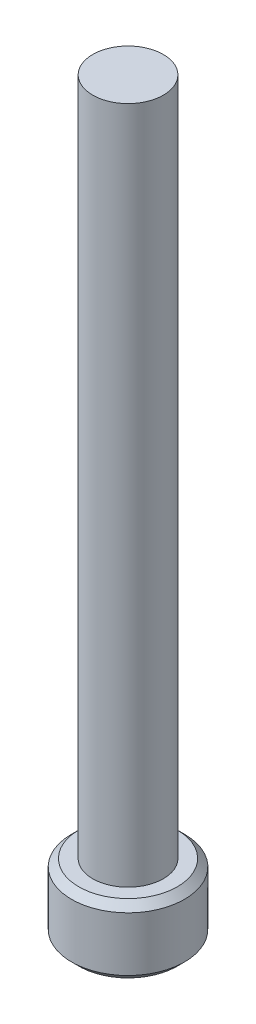
ISO-10303-21;
HEADER;
FILE_DESCRIPTION(('STEP AP214'),'2;1');
FILE_NAME('part.step','',(''),(''),'','','');
FILE_SCHEMA(('AUTOMOTIVE_DESIGN { 1 0 10303 214 1 1 1 1 }'));
ENDSEC;
DATA;
#1=APPLICATION_CONTEXT('core data for automotive mechanical design processes');
#2=APPLICATION_PROTOCOL_DEFINITION('international standard','automotive_design',2000,#1);
#3=PRODUCT_CONTEXT('',#1,'mechanical');
#4=PRODUCT('Part','Part','',(#3));
#5=PRODUCT_RELATED_PRODUCT_CATEGORY('part','',(#4));
#6=PRODUCT_DEFINITION_FORMATION('','',#4);
#7=PRODUCT_DEFINITION_CONTEXT('part definition',#1,'design');
#8=PRODUCT_DEFINITION('design','',#6,#7);
#9=PRODUCT_DEFINITION_SHAPE('','',#8);
#10=(LENGTH_UNIT() NAMED_UNIT(*) SI_UNIT(.MILLI.,.METRE.));
#11=(NAMED_UNIT(*) PLANE_ANGLE_UNIT() SI_UNIT($,.RADIAN.));
#12=(NAMED_UNIT(*) SI_UNIT($,.STERADIAN.) SOLID_ANGLE_UNIT());
#13=UNCERTAINTY_MEASURE_WITH_UNIT(LENGTH_MEASURE(1.E-05),#10,'distance_accuracy_value','');
#14=(GEOMETRIC_REPRESENTATION_CONTEXT(3) GLOBAL_UNCERTAINTY_ASSIGNED_CONTEXT((#13)) GLOBAL_UNIT_ASSIGNED_CONTEXT((#10,
#11,#12)) REPRESENTATION_CONTEXT('',''));
#15=CARTESIAN_POINT('',(0.,0.,0.));
#16=DIRECTION('',(0.,0.,1.));
#17=DIRECTION('',(1.,0.,0.));
#18=AXIS2_PLACEMENT_3D('',#15,#16,#17);
#19=CARTESIAN_POINT('',(0.,47.625,0.));
#20=DIRECTION('',(0.,-1.,0.));
#21=DIRECTION('',(0.,0.,-1.));
#22=AXIS2_PLACEMENT_3D('',#19,#20,#21);
#23=CYLINDRICAL_SURFACE('',#22,2.4765);
#24=CARTESIAN_POINT('',(0.,47.625,0.));
#25=DIRECTION('',(0.,1.,0.));
#26=DIRECTION('',(0.,0.,1.));
#27=AXIS2_PLACEMENT_3D('',#24,#25,#26);
#28=CIRCLE('',#27,2.4765);
#29=CARTESIAN_POINT('',(0.,47.625,2.4765));
#30=VERTEX_POINT('',#29);
#31=EDGE_CURVE('E173',#30,#30,#28,.T.);
#32=ORIENTED_EDGE('',*,*,#31,.F.);
#33=EDGE_LOOP('',(#32));
#34=FACE_BOUND('',#33,.T.);
#35=CARTESIAN_POINT('',(0.,0.,0.));
#36=DIRECTION('',(0.,1.,0.));
#37=DIRECTION('',(0.,0.,1.));
#38=AXIS2_PLACEMENT_3D('',#35,#36,#37);
#39=CIRCLE('',#38,2.4765);
#40=CARTESIAN_POINT('',(0.,0.,2.4765));
#41=VERTEX_POINT('',#40);
#42=EDGE_CURVE('E163',#41,#41,#39,.T.);
#43=ORIENTED_EDGE('',*,*,#42,.T.);
#44=EDGE_LOOP('',(#43));
#45=FACE_BOUND('',#44,.T.);
#46=ADVANCED_FACE('F47',(#34,#45),#23,.T.);
#47=CARTESIAN_POINT('',(0.,47.625,0.));
#48=DIRECTION('',(0.,1.,0.));
#49=DIRECTION('',(0.,0.,1.));
#50=AXIS2_PLACEMENT_3D('',#47,#48,#49);
#51=PLANE('',#50);
#52=ORIENTED_EDGE('',*,*,#31,.T.);
#53=EDGE_LOOP('',(#52));
#54=FACE_BOUND('',#53,.T.);
#55=ADVANCED_FACE('F203',(#54),#51,.T.);
#56=CARTESIAN_POINT('',(0.,-4.826,0.));
#57=DIRECTION('',(0.,1.,0.));
#58=DIRECTION('',(0.,0.,1.));
#59=AXIS2_PLACEMENT_3D('',#56,#57,#58);
#60=CYLINDRICAL_SURFACE('',#59,3.9624);
#61=CARTESIAN_POINT('',(0.,-0.507999999999989,0.));
#62=DIRECTION('',(0.,-1.,0.));
#63=DIRECTION('',(0.,0.,-1.));
#64=AXIS2_PLACEMENT_3D('',#61,#62,#63);
#65=CIRCLE('',#64,3.9624);
#66=CARTESIAN_POINT('',(0.,-0.507999999999989,-3.9624));
#67=VERTEX_POINT('',#66);
#68=EDGE_CURVE('E184',#67,#67,#65,.T.);
#69=ORIENTED_EDGE('',*,*,#68,.T.);
#70=EDGE_LOOP('',(#69));
#71=FACE_BOUND('',#70,.T.);
#72=CARTESIAN_POINT('',(0.,-4.318,0.));
#73=DIRECTION('',(0.,-1.,0.));
#74=DIRECTION('',(0.,0.,-1.));
#75=AXIS2_PLACEMENT_3D('',#72,#73,#74);
#76=CIRCLE('',#75,3.9624);
#77=CARTESIAN_POINT('',(0.,-4.318,-3.9624));
#78=VERTEX_POINT('',#77);
#79=EDGE_CURVE('E177',#78,#78,#76,.F.);
#80=ORIENTED_EDGE('',*,*,#79,.T.);
#81=EDGE_LOOP('',(#80));
#82=FACE_BOUND('',#81,.T.);
#83=ADVANCED_FACE('F199',(#71,#82),#60,.T.);
#84=CARTESIAN_POINT('',(0.,-4.826,0.));
#85=DIRECTION('',(0.,-1.,0.));
#86=DIRECTION('',(0.,0.,-1.));
#87=AXIS2_PLACEMENT_3D('',#84,#85,#86);
#88=PLANE('',#87);
#89=CARTESIAN_POINT('',(0.,-4.826,0.));
#90=DIRECTION('',(0.,-1.,0.));
#91=DIRECTION('',(0.,0.,-1.));
#92=AXIS2_PLACEMENT_3D('',#89,#90,#91);
#93=CIRCLE('',#92,3.4544);
#94=CARTESIAN_POINT('',(0.,-4.826,-3.4544));
#95=VERTEX_POINT('',#94);
#96=EDGE_CURVE('E11',#95,#95,#93,.T.);
#97=ORIENTED_EDGE('',*,*,#96,.T.);
#98=EDGE_LOOP('',(#97));
#99=FACE_BOUND('',#98,.T.);
#100=DIRECTION('',(0.5,0.,0.866025403784439));
#101=VECTOR('',#100,1.);
#102=CARTESIAN_POINT('',(1.14567944042316,-4.826,-1.984375));
#103=LINE('',#102,#101);
#104=CARTESIAN_POINT('',(1.14567944042316,-4.826,-1.984375));
#105=VERTEX_POINT('',#104);
#106=CARTESIAN_POINT('',(2.29135888084633,-4.826,0.));
#107=VERTEX_POINT('',#106);
#108=EDGE_CURVE('E64',#105,#107,#103,.T.);
#109=ORIENTED_EDGE('',*,*,#108,.F.);
#110=DIRECTION('',(1.,0.,0.));
#111=VECTOR('',#110,1.);
#112=CARTESIAN_POINT('',(-1.14567944042316,-4.826,-1.984375));
#113=LINE('',#112,#111);
#114=CARTESIAN_POINT('',(-1.14567944042316,-4.826,-1.984375));
#115=VERTEX_POINT('',#114);
#116=EDGE_CURVE('E157',#115,#105,#113,.T.);
#117=ORIENTED_EDGE('',*,*,#116,.F.);
#118=DIRECTION('',(0.5,0.,-0.866025403784439));
#119=VECTOR('',#118,1.);
#120=CARTESIAN_POINT('',(-2.29135888084633,-4.826,0.));
#121=LINE('',#120,#119);
#122=CARTESIAN_POINT('',(-2.29135888084633,-4.826,0.));
#123=VERTEX_POINT('',#122);
#124=EDGE_CURVE('E154',#123,#115,#121,.T.);
#125=ORIENTED_EDGE('',*,*,#124,.F.);
#126=DIRECTION('',(-0.5,0.,-0.866025403784439));
#127=VECTOR('',#126,1.);
#128=CARTESIAN_POINT('',(-1.14567944042316,-4.826,1.984375));
#129=LINE('',#128,#127);
#130=CARTESIAN_POINT('',(-1.14567944042316,-4.826,1.984375));
#131=VERTEX_POINT('',#130);
#132=EDGE_CURVE('E112',#131,#123,#129,.T.);
#133=ORIENTED_EDGE('',*,*,#132,.F.);
#134=DIRECTION('',(-1.,0.,0.));
#135=VECTOR('',#134,1.);
#136=CARTESIAN_POINT('',(1.14567944042316,-4.826,1.984375));
#137=LINE('',#136,#135);
#138=CARTESIAN_POINT('',(1.14567944042316,-4.826,1.984375));
#139=VERTEX_POINT('',#138);
#140=EDGE_CURVE('E148',#139,#131,#137,.T.);
#141=ORIENTED_EDGE('',*,*,#140,.F.);
#142=DIRECTION('',(-0.5,0.,0.866025403784439));
#143=VECTOR('',#142,1.);
#144=CARTESIAN_POINT('',(2.29135888084633,-4.826,0.));
#145=LINE('',#144,#143);
#146=EDGE_CURVE('E144',#107,#139,#145,.T.);
#147=ORIENTED_EDGE('',*,*,#146,.F.);
#148=EDGE_LOOP('',(#109,#117,#125,#133,#141,#147));
#149=FACE_BOUND('',#148,.T.);
#150=ADVANCED_FACE('F202',(#99,#149),#88,.T.);
#151=CARTESIAN_POINT('',(0.,0.,0.));
#152=DIRECTION('',(0.,-1.,0.));
#153=DIRECTION('',(0.,0.,-1.));
#154=AXIS2_PLACEMENT_3D('',#151,#152,#153);
#155=PLANE('',#154);
#156=CARTESIAN_POINT('',(0.,0.,0.));
#157=DIRECTION('',(0.,-1.,0.));
#158=DIRECTION('',(0.,0.,-1.));
#159=AXIS2_PLACEMENT_3D('',#156,#157,#158);
#160=CIRCLE('',#159,3.45440000000001);
#161=CARTESIAN_POINT('',(0.,0.,-3.45440000000001));
#162=VERTEX_POINT('',#161);
#163=EDGE_CURVE('E57',#162,#162,#160,.F.);
#164=ORIENTED_EDGE('',*,*,#163,.T.);
#165=EDGE_LOOP('',(#164));
#166=FACE_BOUND('',#165,.T.);
#167=ORIENTED_EDGE('',*,*,#42,.F.);
#168=EDGE_LOOP('',(#167));
#169=FACE_BOUND('',#168,.T.);
#170=ADVANCED_FACE('F191',(#166,#169),#155,.F.);
#171=CARTESIAN_POINT('',(1.14567944042316,-2.54,-1.984375));
#172=DIRECTION('',(0.866025403784439,0.,-0.5));
#173=DIRECTION('',(-0.5,0.,-0.866025403784439));
#174=AXIS2_PLACEMENT_3D('',#171,#172,#173);
#175=PLANE('',#174);
#176=ORIENTED_EDGE('',*,*,#108,.T.);
#177=DIRECTION('',(0.,-1.,0.));
#178=VECTOR('',#177,1.);
#179=CARTESIAN_POINT('',(2.29135888084633,-2.54,0.));
#180=LINE('',#179,#178);
#181=CARTESIAN_POINT('',(2.29135888084633,-2.54,0.));
#182=VERTEX_POINT('',#181);
#183=EDGE_CURVE('E94',#182,#107,#180,.T.);
#184=ORIENTED_EDGE('',*,*,#183,.F.);
#185=DIRECTION('',(0.5,0.,0.866025403784439));
#186=VECTOR('',#185,1.);
#187=CARTESIAN_POINT('',(1.14567944042316,-2.54,-1.984375));
#188=LINE('',#187,#186);
#189=CARTESIAN_POINT('',(1.14567944042316,-2.54,-1.984375));
#190=VERTEX_POINT('',#189);
#191=EDGE_CURVE('E160',#190,#182,#188,.T.);
#192=ORIENTED_EDGE('',*,*,#191,.F.);
#193=DIRECTION('',(0.,-1.,0.));
#194=VECTOR('',#193,1.);
#195=CARTESIAN_POINT('',(1.14567944042316,-2.54,-1.984375));
#196=LINE('',#195,#194);
#197=EDGE_CURVE('E72',#190,#105,#196,.T.);
#198=ORIENTED_EDGE('',*,*,#197,.T.);
#199=EDGE_LOOP('',(#176,#184,#192,#198));
#200=FACE_BOUND('',#199,.T.);
#201=ADVANCED_FACE('F222',(#200),#175,.F.);
#202=CARTESIAN_POINT('',(-1.14567944042316,-2.54,-1.984375));
#203=DIRECTION('',(0.,0.,-1.));
#204=DIRECTION('',(-1.,0.,0.));
#205=AXIS2_PLACEMENT_3D('',#202,#203,#204);
#206=PLANE('',#205);
#207=ORIENTED_EDGE('',*,*,#116,.T.);
#208=ORIENTED_EDGE('',*,*,#197,.F.);
#209=DIRECTION('',(1.,0.,0.));
#210=VECTOR('',#209,1.);
#211=CARTESIAN_POINT('',(-1.14567944042316,-2.54,-1.984375));
#212=LINE('',#211,#210);
#213=CARTESIAN_POINT('',(-1.14567944042316,-2.54,-1.984375));
#214=VERTEX_POINT('',#213);
#215=EDGE_CURVE('E126',#214,#190,#212,.T.);
#216=ORIENTED_EDGE('',*,*,#215,.F.);
#217=DIRECTION('',(0.,-1.,0.));
#218=VECTOR('',#217,1.);
#219=CARTESIAN_POINT('',(-1.14567944042316,-2.54,-1.984375));
#220=LINE('',#219,#218);
#221=EDGE_CURVE('E117',#214,#115,#220,.T.);
#222=ORIENTED_EDGE('',*,*,#221,.T.);
#223=EDGE_LOOP('',(#207,#208,#216,#222));
#224=FACE_BOUND('',#223,.T.);
#225=ADVANCED_FACE('F224',(#224),#206,.F.);
#226=CARTESIAN_POINT('',(-2.29135888084633,-2.54,0.));
#227=DIRECTION('',(-0.866025403784439,0.,-0.5));
#228=DIRECTION('',(-0.5,0.,0.866025403784439));
#229=AXIS2_PLACEMENT_3D('',#226,#227,#228);
#230=PLANE('',#229);
#231=ORIENTED_EDGE('',*,*,#124,.T.);
#232=ORIENTED_EDGE('',*,*,#221,.F.);
#233=DIRECTION('',(0.5,0.,-0.866025403784439));
#234=VECTOR('',#233,1.);
#235=CARTESIAN_POINT('',(-2.29135888084633,-2.54,0.));
#236=LINE('',#235,#234);
#237=CARTESIAN_POINT('',(-2.29135888084633,-2.54,0.));
#238=VERTEX_POINT('',#237);
#239=EDGE_CURVE('E121',#238,#214,#236,.T.);
#240=ORIENTED_EDGE('',*,*,#239,.F.);
#241=DIRECTION('',(0.,-1.,0.));
#242=VECTOR('',#241,1.);
#243=CARTESIAN_POINT('',(-2.29135888084633,-2.54,0.));
#244=LINE('',#243,#242);
#245=EDGE_CURVE('E105',#238,#123,#244,.T.);
#246=ORIENTED_EDGE('',*,*,#245,.T.);
#247=EDGE_LOOP('',(#231,#232,#240,#246));
#248=FACE_BOUND('',#247,.T.);
#249=ADVANCED_FACE('F122',(#248),#230,.F.);
#250=CARTESIAN_POINT('',(-1.14567944042316,-2.54,1.984375));
#251=DIRECTION('',(-0.866025403784439,0.,0.5));
#252=DIRECTION('',(0.5,0.,0.866025403784439));
#253=AXIS2_PLACEMENT_3D('',#250,#251,#252);
#254=PLANE('',#253);
#255=ORIENTED_EDGE('',*,*,#132,.T.);
#256=ORIENTED_EDGE('',*,*,#245,.F.);
#257=DIRECTION('',(-0.5,0.,-0.866025403784439));
#258=VECTOR('',#257,1.);
#259=CARTESIAN_POINT('',(-1.14567944042316,-2.54,1.984375));
#260=LINE('',#259,#258);
#261=CARTESIAN_POINT('',(-1.14567944042316,-2.54,1.984375));
#262=VERTEX_POINT('',#261);
#263=EDGE_CURVE('E109',#262,#238,#260,.T.);
#264=ORIENTED_EDGE('',*,*,#263,.F.);
#265=DIRECTION('',(0.,-1.,0.));
#266=VECTOR('',#265,1.);
#267=CARTESIAN_POINT('',(-1.14567944042316,-2.54,1.984375));
#268=LINE('',#267,#266);
#269=EDGE_CURVE('E118',#262,#131,#268,.T.);
#270=ORIENTED_EDGE('',*,*,#269,.T.);
#271=EDGE_LOOP('',(#255,#256,#264,#270));
#272=FACE_BOUND('',#271,.T.);
#273=ADVANCED_FACE('F107',(#272),#254,.F.);
#274=CARTESIAN_POINT('',(1.14567944042316,-2.54,1.984375));
#275=DIRECTION('',(0.,0.,1.));
#276=DIRECTION('',(1.,0.,0.));
#277=AXIS2_PLACEMENT_3D('',#274,#275,#276);
#278=PLANE('',#277);
#279=ORIENTED_EDGE('',*,*,#140,.T.);
#280=ORIENTED_EDGE('',*,*,#269,.F.);
#281=DIRECTION('',(-1.,0.,0.));
#282=VECTOR('',#281,1.);
#283=CARTESIAN_POINT('',(1.14567944042316,-2.54,1.984375));
#284=LINE('',#283,#282);
#285=CARTESIAN_POINT('',(1.14567944042316,-2.54,1.984375));
#286=VERTEX_POINT('',#285);
#287=EDGE_CURVE('E132',#286,#262,#284,.T.);
#288=ORIENTED_EDGE('',*,*,#287,.F.);
#289=DIRECTION('',(0.,-1.,0.));
#290=VECTOR('',#289,1.);
#291=CARTESIAN_POINT('',(1.14567944042316,-2.54,1.984375));
#292=LINE('',#291,#290);
#293=EDGE_CURVE('E168',#286,#139,#292,.T.);
#294=ORIENTED_EDGE('',*,*,#293,.T.);
#295=EDGE_LOOP('',(#279,#280,#288,#294));
#296=FACE_BOUND('',#295,.T.);
#297=ADVANCED_FACE('F301',(#296),#278,.F.);
#298=CARTESIAN_POINT('',(2.29135888084633,-2.54,0.));
#299=DIRECTION('',(0.866025403784439,0.,0.5));
#300=DIRECTION('',(0.5,0.,-0.866025403784439));
#301=AXIS2_PLACEMENT_3D('',#298,#299,#300);
#302=PLANE('',#301);
#303=ORIENTED_EDGE('',*,*,#146,.T.);
#304=ORIENTED_EDGE('',*,*,#293,.F.);
#305=DIRECTION('',(-0.5,0.,0.866025403784439));
#306=VECTOR('',#305,1.);
#307=CARTESIAN_POINT('',(2.29135888084633,-2.54,0.));
#308=LINE('',#307,#306);
#309=EDGE_CURVE('E136',#182,#286,#308,.T.);
#310=ORIENTED_EDGE('',*,*,#309,.F.);
#311=ORIENTED_EDGE('',*,*,#183,.T.);
#312=EDGE_LOOP('',(#303,#304,#310,#311));
#313=FACE_BOUND('',#312,.T.);
#314=ADVANCED_FACE('F218',(#313),#302,.F.);
#315=CARTESIAN_POINT('',(0.,-2.54,0.));
#316=DIRECTION('',(0.,-1.,0.));
#317=DIRECTION('',(0.,0.,-1.));
#318=AXIS2_PLACEMENT_3D('',#315,#316,#317);
#319=PLANE('',#318);
#320=ORIENTED_EDGE('',*,*,#191,.T.);
#321=ORIENTED_EDGE('',*,*,#309,.T.);
#322=ORIENTED_EDGE('',*,*,#287,.T.);
#323=ORIENTED_EDGE('',*,*,#263,.T.);
#324=ORIENTED_EDGE('',*,*,#239,.T.);
#325=ORIENTED_EDGE('',*,*,#215,.T.);
#326=EDGE_LOOP('',(#320,#321,#322,#323,#324,#325));
#327=FACE_BOUND('',#326,.T.);
#328=ADVANCED_FACE('F129',(#327),#319,.T.);
#329=CARTESIAN_POINT('',(0.,-0.507999999999989,0.));
#330=DIRECTION('',(0.,-1.,0.));
#331=DIRECTION('',(0.,0.,-1.));
#332=AXIS2_PLACEMENT_3D('',#329,#330,#331);
#333=CONICAL_SURFACE('',#332,3.9624,0.785398163397448);
#334=ORIENTED_EDGE('',*,*,#163,.F.);
#335=EDGE_LOOP('',(#334));
#336=FACE_BOUND('',#335,.T.);
#337=ORIENTED_EDGE('',*,*,#68,.F.);
#338=EDGE_LOOP('',(#337));
#339=FACE_BOUND('',#338,.T.);
#340=ADVANCED_FACE('F194',(#336,#339),#333,.T.);
#341=CARTESIAN_POINT('',(0.,-4.826,0.));
#342=DIRECTION('',(0.,1.,0.));
#343=DIRECTION('',(0.,0.,1.));
#344=AXIS2_PLACEMENT_3D('',#341,#342,#343);
#345=CONICAL_SURFACE('',#344,3.4544,0.785398163397442);
#346=ORIENTED_EDGE('',*,*,#79,.F.);
#347=EDGE_LOOP('',(#346));
#348=FACE_BOUND('',#347,.T.);
#349=ORIENTED_EDGE('',*,*,#96,.F.);
#350=EDGE_LOOP('',(#349));
#351=FACE_BOUND('',#350,.T.);
#352=ADVANCED_FACE('F50',(#348,#351),#345,.T.);
#353=CLOSED_SHELL('',(#46,#55,#83,#150,#170,#201,#225,#249,#273,#297,#314,#328,#340,#352));
#354=MANIFOLD_SOLID_BREP('B2',#353);
#355=ADVANCED_BREP_SHAPE_REPRESENTATION('',(#18,#354),#14);
#356=SHAPE_DEFINITION_REPRESENTATION(#9,#355);
ENDSEC;
END-ISO-10303-21;
